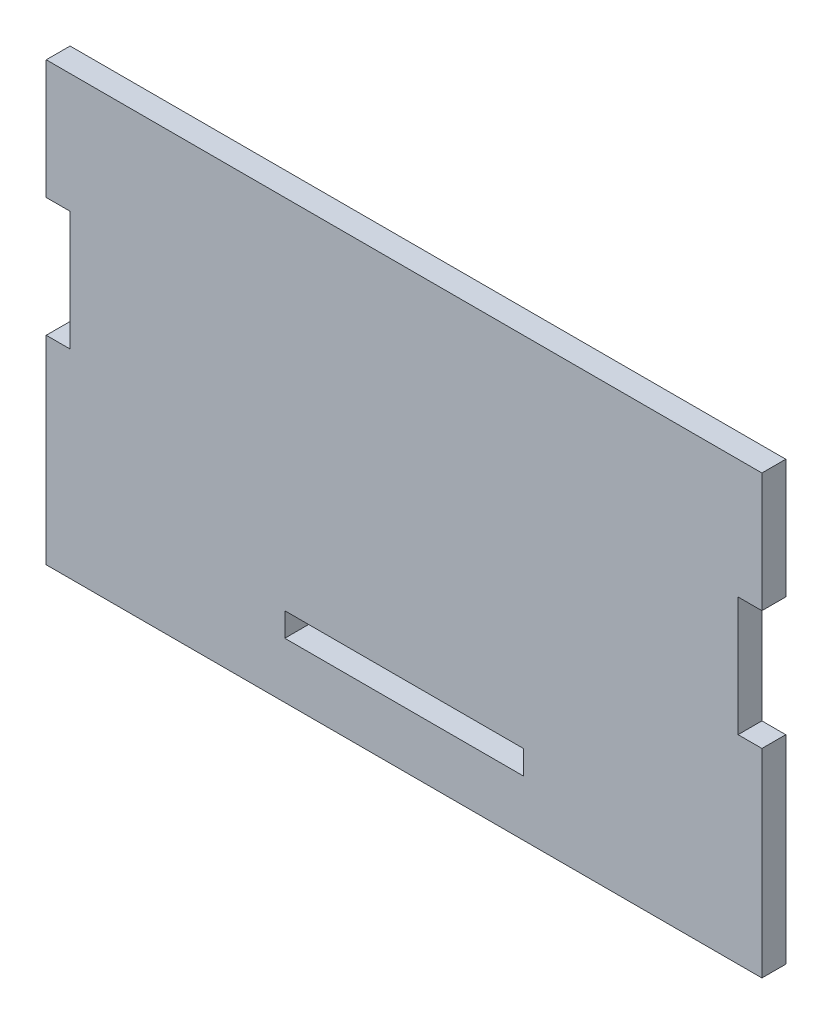
ISO-10303-21;
HEADER;
FILE_DESCRIPTION(('STEP AP214'),'2;1');
FILE_NAME('part.step','',(''),(''),'','','');
FILE_SCHEMA(('AUTOMOTIVE_DESIGN { 1 0 10303 214 1 1 1 1 }'));
ENDSEC;
DATA;
#1=APPLICATION_CONTEXT('core data for automotive mechanical design processes');
#2=APPLICATION_PROTOCOL_DEFINITION('international standard','automotive_design',2000,#1);
#3=PRODUCT_CONTEXT('',#1,'mechanical');
#4=PRODUCT('Part','Part','',(#3));
#5=PRODUCT_RELATED_PRODUCT_CATEGORY('part','',(#4));
#6=PRODUCT_DEFINITION_FORMATION('','',#4);
#7=PRODUCT_DEFINITION_CONTEXT('part definition',#1,'design');
#8=PRODUCT_DEFINITION('design','',#6,#7);
#9=PRODUCT_DEFINITION_SHAPE('','',#8);
#10=(LENGTH_UNIT() NAMED_UNIT(*) SI_UNIT(.MILLI.,.METRE.));
#11=(NAMED_UNIT(*) PLANE_ANGLE_UNIT() SI_UNIT($,.RADIAN.));
#12=(NAMED_UNIT(*) SI_UNIT($,.STERADIAN.) SOLID_ANGLE_UNIT());
#13=UNCERTAINTY_MEASURE_WITH_UNIT(LENGTH_MEASURE(1.E-05),#10,'distance_accuracy_value','');
#14=(GEOMETRIC_REPRESENTATION_CONTEXT(3) GLOBAL_UNCERTAINTY_ASSIGNED_CONTEXT((#13)) GLOBAL_UNIT_ASSIGNED_CONTEXT((#10,
#11,#12)) REPRESENTATION_CONTEXT('',''));
#15=CARTESIAN_POINT('',(0.,0.,0.));
#16=DIRECTION('',(0.,0.,1.));
#17=DIRECTION('',(1.,0.,0.));
#18=AXIS2_PLACEMENT_3D('',#15,#16,#17);
#19=CARTESIAN_POINT('',(42.,0.,3.));
#20=DIRECTION('',(-1.,0.,0.));
#21=DIRECTION('',(0.,0.,1.));
#22=AXIS2_PLACEMENT_3D('',#19,#20,#21);
#23=PLANE('',#22);
#24=DIRECTION('',(0.,1.,0.));
#25=VECTOR('',#24,1.);
#26=CARTESIAN_POINT('',(42.,0.,0.));
#27=LINE('',#26,#25);
#28=CARTESIAN_POINT('',(42.,-2.49999999999999,0.));
#29=VERTEX_POINT('',#28);
#30=CARTESIAN_POINT('',(42.,12.5,0.));
#31=VERTEX_POINT('',#30);
#32=EDGE_CURVE('E255',#29,#31,#27,.T.);
#33=ORIENTED_EDGE('',*,*,#32,.T.);
#34=DIRECTION('',(0.,0.,-1.));
#35=VECTOR('',#34,1.);
#36=CARTESIAN_POINT('',(42.,12.5,3.));
#37=LINE('',#36,#35);
#38=CARTESIAN_POINT('',(42.,12.5,3.));
#39=VERTEX_POINT('',#38);
#40=EDGE_CURVE('E11',#39,#31,#37,.T.);
#41=ORIENTED_EDGE('',*,*,#40,.F.);
#42=DIRECTION('',(0.,1.,0.));
#43=VECTOR('',#42,1.);
#44=CARTESIAN_POINT('',(42.,0.,3.));
#45=LINE('',#44,#43);
#46=CARTESIAN_POINT('',(42.,-2.49999999999999,3.));
#47=VERTEX_POINT('',#46);
#48=EDGE_CURVE('E189',#47,#39,#45,.T.);
#49=ORIENTED_EDGE('',*,*,#48,.F.);
#50=DIRECTION('',(0.,0.,-1.));
#51=VECTOR('',#50,1.);
#52=CARTESIAN_POINT('',(42.,-2.49999999999999,3.));
#53=LINE('',#52,#51);
#54=EDGE_CURVE('E207',#47,#29,#53,.T.);
#55=ORIENTED_EDGE('',*,*,#54,.T.);
#56=EDGE_LOOP('',(#33,#41,#49,#55));
#57=FACE_BOUND('',#56,.T.);
#58=ADVANCED_FACE('F34',(#57),#23,.F.);
#59=CARTESIAN_POINT('',(0.,12.5,3.));
#60=DIRECTION('',(0.,1.,0.));
#61=DIRECTION('',(0.,0.,1.));
#62=AXIS2_PLACEMENT_3D('',#59,#60,#61);
#63=PLANE('',#62);
#64=DIRECTION('',(1.,0.,0.));
#65=VECTOR('',#64,1.);
#66=CARTESIAN_POINT('',(0.,12.5,0.));
#67=LINE('',#66,#65);
#68=CARTESIAN_POINT('',(45.,12.5,0.));
#69=VERTEX_POINT('',#68);
#70=EDGE_CURVE('E258',#31,#69,#67,.T.);
#71=ORIENTED_EDGE('',*,*,#70,.T.);
#72=DIRECTION('',(0.,0.,-1.));
#73=VECTOR('',#72,1.);
#74=CARTESIAN_POINT('',(45.,12.5,3.));
#75=LINE('',#74,#73);
#76=CARTESIAN_POINT('',(45.,12.5,3.));
#77=VERTEX_POINT('',#76);
#78=EDGE_CURVE('E44',#77,#69,#75,.T.);
#79=ORIENTED_EDGE('',*,*,#78,.F.);
#80=DIRECTION('',(1.,0.,0.));
#81=VECTOR('',#80,1.);
#82=CARTESIAN_POINT('',(0.,12.5,3.));
#83=LINE('',#82,#81);
#84=EDGE_CURVE('E183',#39,#77,#83,.T.);
#85=ORIENTED_EDGE('',*,*,#84,.F.);
#86=ORIENTED_EDGE('',*,*,#40,.T.);
#87=EDGE_LOOP('',(#71,#79,#85,#86));
#88=FACE_BOUND('',#87,.T.);
#89=ADVANCED_FACE('F318',(#88),#63,.F.);
#90=CARTESIAN_POINT('',(45.,0.,3.));
#91=DIRECTION('',(-1.,0.,0.));
#92=DIRECTION('',(0.,0.,1.));
#93=AXIS2_PLACEMENT_3D('',#90,#91,#92);
#94=PLANE('',#93);
#95=DIRECTION('',(0.,1.,0.));
#96=VECTOR('',#95,1.);
#97=CARTESIAN_POINT('',(45.,0.,0.));
#98=LINE('',#97,#96);
#99=CARTESIAN_POINT('',(45.,27.5,0.));
#100=VERTEX_POINT('',#99);
#101=EDGE_CURVE('E203',#69,#100,#98,.T.);
#102=ORIENTED_EDGE('',*,*,#101,.T.);
#103=DIRECTION('',(0.,0.,-1.));
#104=VECTOR('',#103,1.);
#105=CARTESIAN_POINT('',(45.,27.5,3.));
#106=LINE('',#105,#104);
#107=CARTESIAN_POINT('',(45.,27.5,3.));
#108=VERTEX_POINT('',#107);
#109=EDGE_CURVE('E223',#108,#100,#106,.T.);
#110=ORIENTED_EDGE('',*,*,#109,.F.);
#111=DIRECTION('',(0.,1.,0.));
#112=VECTOR('',#111,1.);
#113=CARTESIAN_POINT('',(45.,0.,3.));
#114=LINE('',#113,#112);
#115=EDGE_CURVE('E177',#77,#108,#114,.T.);
#116=ORIENTED_EDGE('',*,*,#115,.F.);
#117=ORIENTED_EDGE('',*,*,#78,.T.);
#118=EDGE_LOOP('',(#102,#110,#116,#117));
#119=FACE_BOUND('',#118,.T.);
#120=ADVANCED_FACE('F324',(#119),#94,.F.);
#121=CARTESIAN_POINT('',(0.,27.5,3.));
#122=DIRECTION('',(0.,1.,0.));
#123=DIRECTION('',(0.,0.,1.));
#124=AXIS2_PLACEMENT_3D('',#121,#122,#123);
#125=PLANE('',#124);
#126=DIRECTION('',(1.,0.,0.));
#127=VECTOR('',#126,1.);
#128=CARTESIAN_POINT('',(0.,27.5,0.));
#129=LINE('',#128,#127);
#130=CARTESIAN_POINT('',(-45.,27.5,0.));
#131=VERTEX_POINT('',#130);
#132=EDGE_CURVE('E261',#131,#100,#129,.T.);
#133=ORIENTED_EDGE('',*,*,#132,.F.);
#134=DIRECTION('',(0.,0.,-1.));
#135=VECTOR('',#134,1.);
#136=CARTESIAN_POINT('',(-45.,27.5,3.));
#137=LINE('',#136,#135);
#138=CARTESIAN_POINT('',(-45.,27.5,3.));
#139=VERTEX_POINT('',#138);
#140=EDGE_CURVE('E221',#139,#131,#137,.T.);
#141=ORIENTED_EDGE('',*,*,#140,.F.);
#142=DIRECTION('',(1.,0.,0.));
#143=VECTOR('',#142,1.);
#144=CARTESIAN_POINT('',(0.,27.5,3.));
#145=LINE('',#144,#143);
#146=EDGE_CURVE('E182',#139,#108,#145,.T.);
#147=ORIENTED_EDGE('',*,*,#146,.T.);
#148=ORIENTED_EDGE('',*,*,#109,.T.);
#149=EDGE_LOOP('',(#133,#141,#147,#148));
#150=FACE_BOUND('',#149,.T.);
#151=ADVANCED_FACE('F301',(#150),#125,.T.);
#152=CARTESIAN_POINT('',(-45.,0.,3.));
#153=DIRECTION('',(-1.,0.,0.));
#154=DIRECTION('',(0.,0.,1.));
#155=AXIS2_PLACEMENT_3D('',#152,#153,#154);
#156=PLANE('',#155);
#157=DIRECTION('',(0.,1.,0.));
#158=VECTOR('',#157,1.);
#159=CARTESIAN_POINT('',(-45.,0.,0.));
#160=LINE('',#159,#158);
#161=CARTESIAN_POINT('',(-45.,12.5,0.));
#162=VERTEX_POINT('',#161);
#163=EDGE_CURVE('E264',#162,#131,#160,.T.);
#164=ORIENTED_EDGE('',*,*,#163,.F.);
#165=DIRECTION('',(0.,0.,-1.));
#166=VECTOR('',#165,1.);
#167=CARTESIAN_POINT('',(-45.,12.5,3.));
#168=LINE('',#167,#166);
#169=CARTESIAN_POINT('',(-45.,12.5,3.));
#170=VERTEX_POINT('',#169);
#171=EDGE_CURVE('E219',#170,#162,#168,.T.);
#172=ORIENTED_EDGE('',*,*,#171,.F.);
#173=DIRECTION('',(0.,1.,0.));
#174=VECTOR('',#173,1.);
#175=CARTESIAN_POINT('',(-45.,0.,3.));
#176=LINE('',#175,#174);
#177=EDGE_CURVE('E188',#170,#139,#176,.T.);
#178=ORIENTED_EDGE('',*,*,#177,.T.);
#179=ORIENTED_EDGE('',*,*,#140,.T.);
#180=EDGE_LOOP('',(#164,#172,#178,#179));
#181=FACE_BOUND('',#180,.T.);
#182=ADVANCED_FACE('F296',(#181),#156,.T.);
#183=CARTESIAN_POINT('',(0.,12.5,3.));
#184=DIRECTION('',(0.,1.,0.));
#185=DIRECTION('',(0.,0.,1.));
#186=AXIS2_PLACEMENT_3D('',#183,#184,#185);
#187=PLANE('',#186);
#188=DIRECTION('',(1.,0.,0.));
#189=VECTOR('',#188,1.);
#190=CARTESIAN_POINT('',(0.,12.5,0.));
#191=LINE('',#190,#189);
#192=CARTESIAN_POINT('',(-42.,12.5,0.));
#193=VERTEX_POINT('',#192);
#194=EDGE_CURVE('E267',#162,#193,#191,.T.);
#195=ORIENTED_EDGE('',*,*,#194,.T.);
#196=DIRECTION('',(0.,0.,-1.));
#197=VECTOR('',#196,1.);
#198=CARTESIAN_POINT('',(-42.,12.5,3.));
#199=LINE('',#198,#197);
#200=CARTESIAN_POINT('',(-42.,12.5,3.));
#201=VERTEX_POINT('',#200);
#202=EDGE_CURVE('E216',#201,#193,#199,.T.);
#203=ORIENTED_EDGE('',*,*,#202,.F.);
#204=DIRECTION('',(1.,0.,0.));
#205=VECTOR('',#204,1.);
#206=CARTESIAN_POINT('',(0.,12.5,3.));
#207=LINE('',#206,#205);
#208=EDGE_CURVE('E289',#170,#201,#207,.T.);
#209=ORIENTED_EDGE('',*,*,#208,.F.);
#210=ORIENTED_EDGE('',*,*,#171,.T.);
#211=EDGE_LOOP('',(#195,#203,#209,#210));
#212=FACE_BOUND('',#211,.T.);
#213=ADVANCED_FACE('F305',(#212),#187,.F.);
#214=CARTESIAN_POINT('',(-42.,0.,3.));
#215=DIRECTION('',(1.,0.,0.));
#216=DIRECTION('',(0.,1.,0.));
#217=AXIS2_PLACEMENT_3D('',#214,#215,#216);
#218=PLANE('',#217);
#219=DIRECTION('',(0.,-1.,0.));
#220=VECTOR('',#219,1.);
#221=CARTESIAN_POINT('',(-42.,0.,0.));
#222=LINE('',#221,#220);
#223=CARTESIAN_POINT('',(-42.,-2.5,0.));
#224=VERTEX_POINT('',#223);
#225=EDGE_CURVE('E270',#193,#224,#222,.T.);
#226=ORIENTED_EDGE('',*,*,#225,.T.);
#227=DIRECTION('',(0.,0.,-1.));
#228=VECTOR('',#227,1.);
#229=CARTESIAN_POINT('',(-42.,-2.5,3.));
#230=LINE('',#229,#228);
#231=CARTESIAN_POINT('',(-42.,-2.5,3.));
#232=VERTEX_POINT('',#231);
#233=EDGE_CURVE('E213',#232,#224,#230,.T.);
#234=ORIENTED_EDGE('',*,*,#233,.F.);
#235=DIRECTION('',(0.,-1.,0.));
#236=VECTOR('',#235,1.);
#237=CARTESIAN_POINT('',(-42.,0.,3.));
#238=LINE('',#237,#236);
#239=EDGE_CURVE('E286',#201,#232,#238,.T.);
#240=ORIENTED_EDGE('',*,*,#239,.F.);
#241=ORIENTED_EDGE('',*,*,#202,.T.);
#242=EDGE_LOOP('',(#226,#234,#240,#241));
#243=FACE_BOUND('',#242,.T.);
#244=ADVANCED_FACE('F308',(#243),#218,.F.);
#245=CARTESIAN_POINT('',(0.,-2.5,3.));
#246=DIRECTION('',(0.,-1.,0.));
#247=DIRECTION('',(0.,0.,-1.));
#248=AXIS2_PLACEMENT_3D('',#245,#246,#247);
#249=PLANE('',#248);
#250=DIRECTION('',(-1.,0.,0.));
#251=VECTOR('',#250,1.);
#252=CARTESIAN_POINT('',(0.,-2.5,0.));
#253=LINE('',#252,#251);
#254=CARTESIAN_POINT('',(-45.,-2.5,0.));
#255=VERTEX_POINT('',#254);
#256=EDGE_CURVE('E271',#224,#255,#253,.T.);
#257=ORIENTED_EDGE('',*,*,#256,.T.);
#258=DIRECTION('',(0.,0.,-1.));
#259=VECTOR('',#258,1.);
#260=CARTESIAN_POINT('',(-45.,-2.5,3.));
#261=LINE('',#260,#259);
#262=CARTESIAN_POINT('',(-45.,-2.5,3.));
#263=VERTEX_POINT('',#262);
#264=EDGE_CURVE('E211',#263,#255,#261,.T.);
#265=ORIENTED_EDGE('',*,*,#264,.F.);
#266=DIRECTION('',(-1.,0.,0.));
#267=VECTOR('',#266,1.);
#268=CARTESIAN_POINT('',(0.,-2.5,3.));
#269=LINE('',#268,#267);
#270=EDGE_CURVE('E284',#232,#263,#269,.T.);
#271=ORIENTED_EDGE('',*,*,#270,.F.);
#272=ORIENTED_EDGE('',*,*,#233,.T.);
#273=EDGE_LOOP('',(#257,#265,#271,#272));
#274=FACE_BOUND('',#273,.T.);
#275=ADVANCED_FACE('F283',(#274),#249,.F.);
#276=CARTESIAN_POINT('',(-45.,-27.5,0.));
#277=VERTEX_POINT('',#276);
#278=EDGE_CURVE('E268',#277,#255,#160,.T.);
#279=ORIENTED_EDGE('',*,*,#278,.F.);
#280=DIRECTION('',(0.,0.,-1.));
#281=VECTOR('',#280,1.);
#282=CARTESIAN_POINT('',(-45.,-27.5,3.));
#283=LINE('',#282,#281);
#284=CARTESIAN_POINT('',(-45.,-27.5,3.));
#285=VERTEX_POINT('',#284);
#286=EDGE_CURVE('E172',#285,#277,#283,.T.);
#287=ORIENTED_EDGE('',*,*,#286,.F.);
#288=EDGE_CURVE('E165',#285,#263,#176,.T.);
#289=ORIENTED_EDGE('',*,*,#288,.T.);
#290=ORIENTED_EDGE('',*,*,#264,.T.);
#291=EDGE_LOOP('',(#279,#287,#289,#290));
#292=FACE_BOUND('',#291,.T.);
#293=ADVANCED_FACE('F281',(#292),#156,.T.);
#294=CARTESIAN_POINT('',(0.,-27.5,3.));
#295=DIRECTION('',(0.,1.,0.));
#296=DIRECTION('',(0.,0.,1.));
#297=AXIS2_PLACEMENT_3D('',#294,#295,#296);
#298=PLANE('',#297);
#299=DIRECTION('',(1.,0.,0.));
#300=VECTOR('',#299,1.);
#301=CARTESIAN_POINT('',(0.,-27.5,0.));
#302=LINE('',#301,#300);
#303=CARTESIAN_POINT('',(45.,-27.5,0.));
#304=VERTEX_POINT('',#303);
#305=EDGE_CURVE('E171',#277,#304,#302,.T.);
#306=ORIENTED_EDGE('',*,*,#305,.T.);
#307=DIRECTION('',(0.,0.,-1.));
#308=VECTOR('',#307,1.);
#309=CARTESIAN_POINT('',(45.,-27.5,3.));
#310=LINE('',#309,#308);
#311=CARTESIAN_POINT('',(45.,-27.5,3.));
#312=VERTEX_POINT('',#311);
#313=EDGE_CURVE('E168',#312,#304,#310,.T.);
#314=ORIENTED_EDGE('',*,*,#313,.F.);
#315=DIRECTION('',(1.,0.,0.));
#316=VECTOR('',#315,1.);
#317=CARTESIAN_POINT('',(0.,-27.5,3.));
#318=LINE('',#317,#316);
#319=EDGE_CURVE('E159',#285,#312,#318,.T.);
#320=ORIENTED_EDGE('',*,*,#319,.F.);
#321=ORIENTED_EDGE('',*,*,#286,.T.);
#322=EDGE_LOOP('',(#306,#314,#320,#321));
#323=FACE_BOUND('',#322,.T.);
#324=ADVANCED_FACE('F169',(#323),#298,.F.);
#325=CARTESIAN_POINT('',(45.,-2.49999999999999,0.));
#326=VERTEX_POINT('',#325);
#327=EDGE_CURVE('E106',#304,#326,#98,.T.);
#328=ORIENTED_EDGE('',*,*,#327,.T.);
#329=DIRECTION('',(0.,0.,-1.));
#330=VECTOR('',#329,1.);
#331=CARTESIAN_POINT('',(45.,-2.49999999999999,3.));
#332=LINE('',#331,#330);
#333=CARTESIAN_POINT('',(45.,-2.49999999999999,3.));
#334=VERTEX_POINT('',#333);
#335=EDGE_CURVE('E173',#334,#326,#332,.T.);
#336=ORIENTED_EDGE('',*,*,#335,.F.);
#337=EDGE_CURVE('E163',#312,#334,#114,.T.);
#338=ORIENTED_EDGE('',*,*,#337,.F.);
#339=ORIENTED_EDGE('',*,*,#313,.T.);
#340=EDGE_LOOP('',(#328,#336,#338,#339));
#341=FACE_BOUND('',#340,.T.);
#342=ADVANCED_FACE('F175',(#341),#94,.F.);
#343=CARTESIAN_POINT('',(15.,0.,3.));
#344=DIRECTION('',(-1.,0.,0.));
#345=DIRECTION('',(0.,0.,1.));
#346=AXIS2_PLACEMENT_3D('',#343,#344,#345);
#347=PLANE('',#346);
#348=DIRECTION('',(0.,1.,0.));
#349=VECTOR('',#348,1.);
#350=CARTESIAN_POINT('',(15.,0.,0.));
#351=LINE('',#350,#349);
#352=CARTESIAN_POINT('',(15.,-20.5,0.));
#353=VERTEX_POINT('',#352);
#354=CARTESIAN_POINT('',(15.,-17.5,0.));
#355=VERTEX_POINT('',#354);
#356=EDGE_CURVE('E241',#353,#355,#351,.T.);
#357=ORIENTED_EDGE('',*,*,#356,.F.);
#358=DIRECTION('',(0.,0.,-1.));
#359=VECTOR('',#358,1.);
#360=CARTESIAN_POINT('',(15.,-20.5,3.));
#361=LINE('',#360,#359);
#362=CARTESIAN_POINT('',(15.,-20.5,3.));
#363=VERTEX_POINT('',#362);
#364=EDGE_CURVE('E38',#363,#353,#361,.T.);
#365=ORIENTED_EDGE('',*,*,#364,.F.);
#366=DIRECTION('',(0.,1.,0.));
#367=VECTOR('',#366,1.);
#368=CARTESIAN_POINT('',(15.,0.,3.));
#369=LINE('',#368,#367);
#370=CARTESIAN_POINT('',(15.,-17.5,3.));
#371=VERTEX_POINT('',#370);
#372=EDGE_CURVE('E200',#363,#371,#369,.T.);
#373=ORIENTED_EDGE('',*,*,#372,.T.);
#374=DIRECTION('',(0.,0.,-1.));
#375=VECTOR('',#374,1.);
#376=CARTESIAN_POINT('',(15.,-17.5,3.));
#377=LINE('',#376,#375);
#378=EDGE_CURVE('E178',#371,#355,#377,.T.);
#379=ORIENTED_EDGE('',*,*,#378,.T.);
#380=EDGE_LOOP('',(#357,#365,#373,#379));
#381=FACE_BOUND('',#380,.T.);
#382=ADVANCED_FACE('F36',(#381),#347,.T.);
#383=CARTESIAN_POINT('',(0.,-20.5,3.));
#384=DIRECTION('',(0.,1.,0.));
#385=DIRECTION('',(0.,0.,1.));
#386=AXIS2_PLACEMENT_3D('',#383,#384,#385);
#387=PLANE('',#386);
#388=DIRECTION('',(1.,0.,0.));
#389=VECTOR('',#388,1.);
#390=CARTESIAN_POINT('',(0.,-20.5,0.));
#391=LINE('',#390,#389);
#392=CARTESIAN_POINT('',(-15.,-20.5,0.));
#393=VERTEX_POINT('',#392);
#394=EDGE_CURVE('E238',#393,#353,#391,.T.);
#395=ORIENTED_EDGE('',*,*,#394,.F.);
#396=DIRECTION('',(0.,0.,-1.));
#397=VECTOR('',#396,1.);
#398=CARTESIAN_POINT('',(-15.,-20.5,3.));
#399=LINE('',#398,#397);
#400=CARTESIAN_POINT('',(-15.,-20.5,3.));
#401=VERTEX_POINT('',#400);
#402=EDGE_CURVE('E230',#401,#393,#399,.T.);
#403=ORIENTED_EDGE('',*,*,#402,.F.);
#404=DIRECTION('',(1.,0.,0.));
#405=VECTOR('',#404,1.);
#406=CARTESIAN_POINT('',(0.,-20.5,3.));
#407=LINE('',#406,#405);
#408=EDGE_CURVE('E197',#401,#363,#407,.T.);
#409=ORIENTED_EDGE('',*,*,#408,.T.);
#410=ORIENTED_EDGE('',*,*,#364,.T.);
#411=EDGE_LOOP('',(#395,#403,#409,#410));
#412=FACE_BOUND('',#411,.T.);
#413=ADVANCED_FACE('F236',(#412),#387,.T.);
#414=CARTESIAN_POINT('',(-15.,0.,3.));
#415=DIRECTION('',(-1.,0.,0.));
#416=DIRECTION('',(0.,0.,1.));
#417=AXIS2_PLACEMENT_3D('',#414,#415,#416);
#418=PLANE('',#417);
#419=DIRECTION('',(0.,1.,0.));
#420=VECTOR('',#419,1.);
#421=CARTESIAN_POINT('',(-15.,0.,0.));
#422=LINE('',#421,#420);
#423=CARTESIAN_POINT('',(-15.,-17.5,0.));
#424=VERTEX_POINT('',#423);
#425=EDGE_CURVE('E249',#393,#424,#422,.T.);
#426=ORIENTED_EDGE('',*,*,#425,.T.);
#427=DIRECTION('',(0.,0.,-1.));
#428=VECTOR('',#427,1.);
#429=CARTESIAN_POINT('',(-15.,-17.5,3.));
#430=LINE('',#429,#428);
#431=CARTESIAN_POINT('',(-15.,-17.5,3.));
#432=VERTEX_POINT('',#431);
#433=EDGE_CURVE('E228',#432,#424,#430,.T.);
#434=ORIENTED_EDGE('',*,*,#433,.F.);
#435=DIRECTION('',(0.,1.,0.));
#436=VECTOR('',#435,1.);
#437=CARTESIAN_POINT('',(-15.,0.,3.));
#438=LINE('',#437,#436);
#439=EDGE_CURVE('E195',#401,#432,#438,.T.);
#440=ORIENTED_EDGE('',*,*,#439,.F.);
#441=ORIENTED_EDGE('',*,*,#402,.T.);
#442=EDGE_LOOP('',(#426,#434,#440,#441));
#443=FACE_BOUND('',#442,.T.);
#444=ADVANCED_FACE('F333',(#443),#418,.F.);
#445=CARTESIAN_POINT('',(0.,-17.5,3.));
#446=DIRECTION('',(0.,1.,0.));
#447=DIRECTION('',(0.,0.,1.));
#448=AXIS2_PLACEMENT_3D('',#445,#446,#447);
#449=PLANE('',#448);
#450=DIRECTION('',(1.,0.,0.));
#451=VECTOR('',#450,1.);
#452=CARTESIAN_POINT('',(0.,-17.5,0.));
#453=LINE('',#452,#451);
#454=EDGE_CURVE('E251',#424,#355,#453,.T.);
#455=ORIENTED_EDGE('',*,*,#454,.T.);
#456=ORIENTED_EDGE('',*,*,#378,.F.);
#457=DIRECTION('',(1.,0.,0.));
#458=VECTOR('',#457,1.);
#459=CARTESIAN_POINT('',(0.,-17.5,3.));
#460=LINE('',#459,#458);
#461=EDGE_CURVE('E191',#432,#371,#460,.T.);
#462=ORIENTED_EDGE('',*,*,#461,.F.);
#463=ORIENTED_EDGE('',*,*,#433,.T.);
#464=EDGE_LOOP('',(#455,#456,#462,#463));
#465=FACE_BOUND('',#464,.T.);
#466=ADVANCED_FACE('F329',(#465),#449,.F.);
#467=CARTESIAN_POINT('',(0.,-2.49999999999999,3.));
#468=DIRECTION('',(0.,-1.,0.));
#469=DIRECTION('',(0.,0.,-1.));
#470=AXIS2_PLACEMENT_3D('',#467,#468,#469);
#471=PLANE('',#470);
#472=DIRECTION('',(-1.,0.,0.));
#473=VECTOR('',#472,1.);
#474=CARTESIAN_POINT('',(0.,-2.49999999999999,0.));
#475=LINE('',#474,#473);
#476=EDGE_CURVE('E112',#326,#29,#475,.T.);
#477=ORIENTED_EDGE('',*,*,#476,.T.);
#478=ORIENTED_EDGE('',*,*,#54,.F.);
#479=DIRECTION('',(-1.,0.,0.));
#480=VECTOR('',#479,1.);
#481=CARTESIAN_POINT('',(0.,-2.49999999999999,3.));
#482=LINE('',#481,#480);
#483=EDGE_CURVE('E53',#334,#47,#482,.T.);
#484=ORIENTED_EDGE('',*,*,#483,.F.);
#485=ORIENTED_EDGE('',*,*,#335,.T.);
#486=EDGE_LOOP('',(#477,#478,#484,#485));
#487=FACE_BOUND('',#486,.T.);
#488=ADVANCED_FACE('F332',(#487),#471,.F.);
#489=CARTESIAN_POINT('',(0.,0.,3.));
#490=DIRECTION('',(0.,0.,1.));
#491=DIRECTION('',(1.,0.,0.));
#492=AXIS2_PLACEMENT_3D('',#489,#490,#491);
#493=PLANE('',#492);
#494=ORIENTED_EDGE('',*,*,#372,.F.);
#495=ORIENTED_EDGE('',*,*,#408,.F.);
#496=ORIENTED_EDGE('',*,*,#439,.T.);
#497=ORIENTED_EDGE('',*,*,#461,.T.);
#498=EDGE_LOOP('',(#494,#495,#496,#497));
#499=FACE_BOUND('',#498,.T.);
#500=ORIENTED_EDGE('',*,*,#48,.T.);
#501=ORIENTED_EDGE('',*,*,#84,.T.);
#502=ORIENTED_EDGE('',*,*,#115,.T.);
#503=ORIENTED_EDGE('',*,*,#146,.F.);
#504=ORIENTED_EDGE('',*,*,#177,.F.);
#505=ORIENTED_EDGE('',*,*,#208,.T.);
#506=ORIENTED_EDGE('',*,*,#239,.T.);
#507=ORIENTED_EDGE('',*,*,#270,.T.);
#508=ORIENTED_EDGE('',*,*,#288,.F.);
#509=ORIENTED_EDGE('',*,*,#319,.T.);
#510=ORIENTED_EDGE('',*,*,#337,.T.);
#511=ORIENTED_EDGE('',*,*,#483,.T.);
#512=EDGE_LOOP('',(#500,#501,#502,#503,#504,#505,#506,#507,#508,#509,#510,#511));
#513=FACE_BOUND('',#512,.T.);
#514=ADVANCED_FACE('F161',(#499,#513),#493,.T.);
#515=CARTESIAN_POINT('',(0.,0.,0.));
#516=DIRECTION('',(0.,0.,1.));
#517=DIRECTION('',(1.,0.,0.));
#518=AXIS2_PLACEMENT_3D('',#515,#516,#517);
#519=PLANE('',#518);
#520=ORIENTED_EDGE('',*,*,#356,.T.);
#521=ORIENTED_EDGE('',*,*,#454,.F.);
#522=ORIENTED_EDGE('',*,*,#425,.F.);
#523=ORIENTED_EDGE('',*,*,#394,.T.);
#524=EDGE_LOOP('',(#520,#521,#522,#523));
#525=FACE_BOUND('',#524,.T.);
#526=ORIENTED_EDGE('',*,*,#32,.F.);
#527=ORIENTED_EDGE('',*,*,#476,.F.);
#528=ORIENTED_EDGE('',*,*,#327,.F.);
#529=ORIENTED_EDGE('',*,*,#305,.F.);
#530=ORIENTED_EDGE('',*,*,#278,.T.);
#531=ORIENTED_EDGE('',*,*,#256,.F.);
#532=ORIENTED_EDGE('',*,*,#225,.F.);
#533=ORIENTED_EDGE('',*,*,#194,.F.);
#534=ORIENTED_EDGE('',*,*,#163,.T.);
#535=ORIENTED_EDGE('',*,*,#132,.T.);
#536=ORIENTED_EDGE('',*,*,#101,.F.);
#537=ORIENTED_EDGE('',*,*,#70,.F.);
#538=EDGE_LOOP('',(#526,#527,#528,#529,#530,#531,#532,#533,#534,#535,#536,#537));
#539=FACE_BOUND('',#538,.T.);
#540=ADVANCED_FACE('F247',(#525,#539),#519,.F.);
#541=CLOSED_SHELL('',(#58,#89,#120,#151,#182,#213,#244,#275,#293,#324,#342,#382,#413,#444,#466,
#488,#514,#540));
#542=MANIFOLD_SOLID_BREP('B2',#541);
#543=ADVANCED_BREP_SHAPE_REPRESENTATION('',(#18,#542),#14);
#544=SHAPE_DEFINITION_REPRESENTATION(#9,#543);
ENDSEC;
END-ISO-10303-21;
